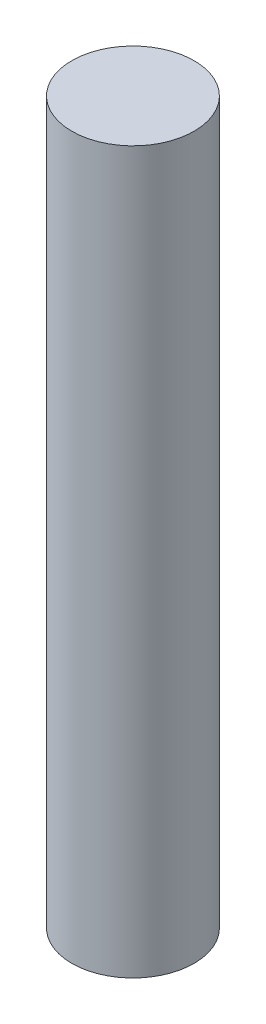
ISO-10303-21;
HEADER;
FILE_DESCRIPTION(('STEP AP214'),'2;1');
FILE_NAME('part.step','',(''),(''),'','','');
FILE_SCHEMA(('AUTOMOTIVE_DESIGN { 1 0 10303 214 1 1 1 1 }'));
ENDSEC;
DATA;
#1=APPLICATION_CONTEXT('core data for automotive mechanical design processes');
#2=APPLICATION_PROTOCOL_DEFINITION('international standard','automotive_design',2000,#1);
#3=PRODUCT_CONTEXT('',#1,'mechanical');
#4=PRODUCT('Part','Part','',(#3));
#5=PRODUCT_RELATED_PRODUCT_CATEGORY('part','',(#4));
#6=PRODUCT_DEFINITION_FORMATION('','',#4);
#7=PRODUCT_DEFINITION_CONTEXT('part definition',#1,'design');
#8=PRODUCT_DEFINITION('design','',#6,#7);
#9=PRODUCT_DEFINITION_SHAPE('','',#8);
#10=(LENGTH_UNIT() NAMED_UNIT(*) SI_UNIT(.MILLI.,.METRE.));
#11=(NAMED_UNIT(*) PLANE_ANGLE_UNIT() SI_UNIT($,.RADIAN.));
#12=(NAMED_UNIT(*) SI_UNIT($,.STERADIAN.) SOLID_ANGLE_UNIT());
#13=UNCERTAINTY_MEASURE_WITH_UNIT(LENGTH_MEASURE(1.E-05),#10,'distance_accuracy_value','');
#14=(GEOMETRIC_REPRESENTATION_CONTEXT(3) GLOBAL_UNCERTAINTY_ASSIGNED_CONTEXT((#13)) GLOBAL_UNIT_ASSIGNED_CONTEXT((#10,
#11,#12)) REPRESENTATION_CONTEXT('',''));
#15=CARTESIAN_POINT('',(0.,0.,0.));
#16=DIRECTION('',(0.,0.,1.));
#17=DIRECTION('',(1.,0.,0.));
#18=AXIS2_PLACEMENT_3D('',#15,#16,#17);
#19=CARTESIAN_POINT('',(0.,16.5,0.));
#20=DIRECTION('',(0.,-1.,0.));
#21=DIRECTION('',(0.,0.,-1.));
#22=AXIS2_PLACEMENT_3D('',#19,#20,#21);
#23=CYLINDRICAL_SURFACE('',#22,1.4);
#24=CARTESIAN_POINT('',(0.,16.5,0.));
#25=DIRECTION('',(0.,1.,0.));
#26=DIRECTION('',(0.,0.,1.));
#27=AXIS2_PLACEMENT_3D('',#24,#25,#26);
#28=CIRCLE('',#27,1.4);
#29=CARTESIAN_POINT('',(0.,16.5,1.4));
#30=VERTEX_POINT('',#29);
#31=EDGE_CURVE('E10',#30,#30,#28,.T.);
#32=ORIENTED_EDGE('',*,*,#31,.F.);
#33=EDGE_LOOP('',(#32));
#34=FACE_BOUND('',#33,.T.);
#35=CARTESIAN_POINT('',(0.,0.,0.));
#36=DIRECTION('',(0.,1.,0.));
#37=DIRECTION('',(0.,0.,1.));
#38=AXIS2_PLACEMENT_3D('',#35,#36,#37);
#39=CIRCLE('',#38,1.4);
#40=CARTESIAN_POINT('',(0.,0.,1.4));
#41=VERTEX_POINT('',#40);
#42=EDGE_CURVE('E36',#41,#41,#39,.T.);
#43=ORIENTED_EDGE('',*,*,#42,.T.);
#44=EDGE_LOOP('',(#43));
#45=FACE_BOUND('',#44,.T.);
#46=ADVANCED_FACE('F33',(#34,#45),#23,.T.);
#47=CARTESIAN_POINT('',(0.,16.5,0.));
#48=DIRECTION('',(0.,1.,0.));
#49=DIRECTION('',(0.,0.,1.));
#50=AXIS2_PLACEMENT_3D('',#47,#48,#49);
#51=PLANE('',#50);
#52=ORIENTED_EDGE('',*,*,#31,.T.);
#53=EDGE_LOOP('',(#52));
#54=FACE_BOUND('',#53,.T.);
#55=ADVANCED_FACE('F48',(#54),#51,.T.);
#56=CARTESIAN_POINT('',(0.,0.,0.));
#57=DIRECTION('',(0.,1.,0.));
#58=DIRECTION('',(0.,0.,1.));
#59=AXIS2_PLACEMENT_3D('',#56,#57,#58);
#60=PLANE('',#59);
#61=ORIENTED_EDGE('',*,*,#42,.F.);
#62=EDGE_LOOP('',(#61));
#63=FACE_BOUND('',#62,.T.);
#64=ADVANCED_FACE('F46',(#63),#60,.F.);
#65=CLOSED_SHELL('',(#46,#55,#64));
#66=MANIFOLD_SOLID_BREP('B2',#65);
#67=ADVANCED_BREP_SHAPE_REPRESENTATION('',(#18,#66),#14);
#68=SHAPE_DEFINITION_REPRESENTATION(#9,#67);
ENDSEC;
END-ISO-10303-21;
